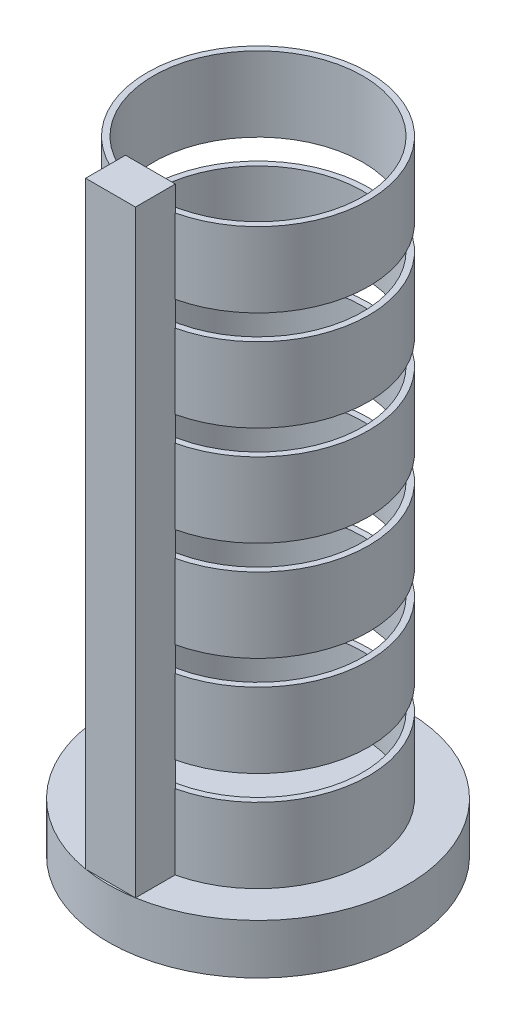
ISO-10303-21;
HEADER;
FILE_DESCRIPTION(('STEP AP214'),'2;1');
FILE_NAME('part.step','',(''),(''),'','','');
FILE_SCHEMA(('AUTOMOTIVE_DESIGN { 1 0 10303 214 1 1 1 1 }'));
ENDSEC;
DATA;
#1=APPLICATION_CONTEXT('core data for automotive mechanical design processes');
#2=APPLICATION_PROTOCOL_DEFINITION('international standard','automotive_design',2000,#1);
#3=PRODUCT_CONTEXT('',#1,'mechanical');
#4=PRODUCT('Part','Part','',(#3));
#5=PRODUCT_RELATED_PRODUCT_CATEGORY('part','',(#4));
#6=PRODUCT_DEFINITION_FORMATION('','',#4);
#7=PRODUCT_DEFINITION_CONTEXT('part definition',#1,'design');
#8=PRODUCT_DEFINITION('design','',#6,#7);
#9=PRODUCT_DEFINITION_SHAPE('','',#8);
#10=(LENGTH_UNIT() NAMED_UNIT(*) SI_UNIT(.MILLI.,.METRE.));
#11=(NAMED_UNIT(*) PLANE_ANGLE_UNIT() SI_UNIT($,.RADIAN.));
#12=(NAMED_UNIT(*) SI_UNIT($,.STERADIAN.) SOLID_ANGLE_UNIT());
#13=UNCERTAINTY_MEASURE_WITH_UNIT(LENGTH_MEASURE(1.E-05),#10,'distance_accuracy_value','');
#14=(GEOMETRIC_REPRESENTATION_CONTEXT(3) GLOBAL_UNCERTAINTY_ASSIGNED_CONTEXT((#13)) GLOBAL_UNIT_ASSIGNED_CONTEXT((#10,
#11,#12)) REPRESENTATION_CONTEXT('',''));
#15=CARTESIAN_POINT('',(0.,0.,0.));
#16=DIRECTION('',(0.,0.,1.));
#17=DIRECTION('',(1.,0.,0.));
#18=AXIS2_PLACEMENT_3D('',#15,#16,#17);
#19=CARTESIAN_POINT('',(-6.35,165.1,27.4071066226826));
#20=DIRECTION('',(1.,0.,0.));
#21=DIRECTION('',(0.,0.,-1.));
#22=AXIS2_PLACEMENT_3D('',#19,#20,#21);
#23=PLANE('',#22);
#24=DIRECTION('',(0.,0.,1.));
#25=VECTOR('',#24,1.);
#26=CARTESIAN_POINT('',(-6.35,139.7,27.4071066226826));
#27=LINE('',#26,#25);
#28=CARTESIAN_POINT('',(-6.35,139.7,27.4071066226826));
#29=VERTEX_POINT('',#28);
#30=CARTESIAN_POINT('',(-6.35,139.7,27.4696038558986));
#31=VERTEX_POINT('',#30);
#32=EDGE_CURVE('E246',#29,#31,#27,.T.);
#33=ORIENTED_EDGE('',*,*,#32,.F.);
#34=DIRECTION('',(0.,-1.,0.));
#35=VECTOR('',#34,1.);
#36=CARTESIAN_POINT('',(-6.35,165.1,27.4071066226826));
#37=LINE('',#36,#35);
#38=CARTESIAN_POINT('',(-6.35,133.35,27.4071066226826));
#39=VERTEX_POINT('',#38);
#40=EDGE_CURVE('E67',#29,#39,#37,.T.);
#41=ORIENTED_EDGE('',*,*,#40,.T.);
#42=DIRECTION('',(0.,0.,1.));
#43=VECTOR('',#42,1.);
#44=CARTESIAN_POINT('',(-6.35,133.35,27.4071066226826));
#45=LINE('',#44,#43);
#46=CARTESIAN_POINT('',(-6.35,133.35,27.4696038558986));
#47=VERTEX_POINT('',#46);
#48=EDGE_CURVE('E274',#39,#47,#45,.T.);
#49=ORIENTED_EDGE('',*,*,#48,.T.);
#50=DIRECTION('',(0.,1.,0.));
#51=VECTOR('',#50,1.);
#52=CARTESIAN_POINT('',(-6.35,114.3,27.4696038558986));
#53=LINE('',#52,#51);
#54=CARTESIAN_POINT('',(-6.35,114.3,27.4696038558986));
#55=VERTEX_POINT('',#54);
#56=EDGE_CURVE('E283',#47,#55,#53,.F.);
#57=ORIENTED_EDGE('',*,*,#56,.T.);
#58=DIRECTION('',(0.,0.,1.));
#59=VECTOR('',#58,1.);
#60=CARTESIAN_POINT('',(-6.35,114.3,27.4071066226826));
#61=LINE('',#60,#59);
#62=CARTESIAN_POINT('',(-6.35,114.3,27.4071066226826));
#63=VERTEX_POINT('',#62);
#64=EDGE_CURVE('E280',#63,#55,#61,.T.);
#65=ORIENTED_EDGE('',*,*,#64,.F.);
#66=CARTESIAN_POINT('',(-6.35,107.95,27.4071066226826));
#67=VERTEX_POINT('',#66);
#68=EDGE_CURVE('E525',#63,#67,#37,.T.);
#69=ORIENTED_EDGE('',*,*,#68,.T.);
#70=DIRECTION('',(0.,0.,1.));
#71=VECTOR('',#70,1.);
#72=CARTESIAN_POINT('',(-6.35,107.95,27.4071066226826));
#73=LINE('',#72,#71);
#74=CARTESIAN_POINT('',(-6.35,107.95,27.4696038558986));
#75=VERTEX_POINT('',#74);
#76=EDGE_CURVE('E307',#67,#75,#73,.T.);
#77=ORIENTED_EDGE('',*,*,#76,.T.);
#78=DIRECTION('',(0.,1.,0.));
#79=VECTOR('',#78,1.);
#80=CARTESIAN_POINT('',(-6.35,88.9,27.4696038558986));
#81=LINE('',#80,#79);
#82=CARTESIAN_POINT('',(-6.35,88.9,27.4696038558986));
#83=VERTEX_POINT('',#82);
#84=EDGE_CURVE('E317',#75,#83,#81,.F.);
#85=ORIENTED_EDGE('',*,*,#84,.T.);
#86=DIRECTION('',(0.,0.,1.));
#87=VECTOR('',#86,1.);
#88=CARTESIAN_POINT('',(-6.35,88.9,27.4071066226826));
#89=LINE('',#88,#87);
#90=CARTESIAN_POINT('',(-6.35,88.9,27.4071066226826));
#91=VERTEX_POINT('',#90);
#92=EDGE_CURVE('E314',#91,#83,#89,.T.);
#93=ORIENTED_EDGE('',*,*,#92,.F.);
#94=CARTESIAN_POINT('',(-6.35,82.55,27.4071066226826));
#95=VERTEX_POINT('',#94);
#96=EDGE_CURVE('E527',#91,#95,#37,.T.);
#97=ORIENTED_EDGE('',*,*,#96,.T.);
#98=DIRECTION('',(0.,0.,1.));
#99=VECTOR('',#98,1.);
#100=CARTESIAN_POINT('',(-6.35,82.55,27.4071066226826));
#101=LINE('',#100,#99);
#102=CARTESIAN_POINT('',(-6.35,82.55,27.4696038558986));
#103=VERTEX_POINT('',#102);
#104=EDGE_CURVE('E341',#95,#103,#101,.T.);
#105=ORIENTED_EDGE('',*,*,#104,.T.);
#106=DIRECTION('',(0.,1.,0.));
#107=VECTOR('',#106,1.);
#108=CARTESIAN_POINT('',(-6.35,63.5,27.4696038558986));
#109=LINE('',#108,#107);
#110=CARTESIAN_POINT('',(-6.35,63.5,27.4696038558986));
#111=VERTEX_POINT('',#110);
#112=EDGE_CURVE('E351',#103,#111,#109,.F.);
#113=ORIENTED_EDGE('',*,*,#112,.T.);
#114=DIRECTION('',(0.,0.,1.));
#115=VECTOR('',#114,1.);
#116=CARTESIAN_POINT('',(-6.35,63.5,27.4071066226826));
#117=LINE('',#116,#115);
#118=CARTESIAN_POINT('',(-6.35,63.5,27.4071066226826));
#119=VERTEX_POINT('',#118);
#120=EDGE_CURVE('E348',#119,#111,#117,.T.);
#121=ORIENTED_EDGE('',*,*,#120,.F.);
#122=CARTESIAN_POINT('',(-6.35,57.15,27.4071066226826));
#123=VERTEX_POINT('',#122);
#124=EDGE_CURVE('E532',#119,#123,#37,.T.);
#125=ORIENTED_EDGE('',*,*,#124,.T.);
#126=DIRECTION('',(0.,0.,1.));
#127=VECTOR('',#126,1.);
#128=CARTESIAN_POINT('',(-6.35,57.15,27.4071066226826));
#129=LINE('',#128,#127);
#130=CARTESIAN_POINT('',(-6.35,57.15,27.4696038558986));
#131=VERTEX_POINT('',#130);
#132=EDGE_CURVE('E375',#123,#131,#129,.T.);
#133=ORIENTED_EDGE('',*,*,#132,.T.);
#134=DIRECTION('',(0.,1.,0.));
#135=VECTOR('',#134,1.);
#136=CARTESIAN_POINT('',(-6.35,38.1,27.4696038558986));
#137=LINE('',#136,#135);
#138=CARTESIAN_POINT('',(-6.35,38.1,27.4696038558986));
#139=VERTEX_POINT('',#138);
#140=EDGE_CURVE('E385',#131,#139,#137,.F.);
#141=ORIENTED_EDGE('',*,*,#140,.T.);
#142=DIRECTION('',(0.,0.,1.));
#143=VECTOR('',#142,1.);
#144=CARTESIAN_POINT('',(-6.35,38.1,27.4071066226826));
#145=LINE('',#144,#143);
#146=CARTESIAN_POINT('',(-6.35,38.1,27.4071066226826));
#147=VERTEX_POINT('',#146);
#148=EDGE_CURVE('E382',#147,#139,#145,.T.);
#149=ORIENTED_EDGE('',*,*,#148,.F.);
#150=CARTESIAN_POINT('',(-6.35,31.7500000000001,27.4071066226826));
#151=VERTEX_POINT('',#150);
#152=EDGE_CURVE('E431',#147,#151,#37,.T.);
#153=ORIENTED_EDGE('',*,*,#152,.T.);
#154=DIRECTION('',(0.,0.,1.));
#155=VECTOR('',#154,1.);
#156=CARTESIAN_POINT('',(-6.35,31.75,27.4071066226826));
#157=LINE('',#156,#155);
#158=CARTESIAN_POINT('',(-6.35,31.75,27.4696038558986));
#159=VERTEX_POINT('',#158);
#160=EDGE_CURVE('E408',#151,#159,#157,.T.);
#161=ORIENTED_EDGE('',*,*,#160,.T.);
#162=DIRECTION('',(0.,1.,0.));
#163=VECTOR('',#162,1.);
#164=CARTESIAN_POINT('',(-6.35,12.7,27.4696038558986));
#165=LINE('',#164,#163);
#166=CARTESIAN_POINT('',(-6.35,12.7,27.4696038558986));
#167=VERTEX_POINT('',#166);
#168=EDGE_CURVE('E412',#159,#167,#165,.F.);
#169=ORIENTED_EDGE('',*,*,#168,.T.);
#170=DIRECTION('',(0.,0.,1.));
#171=VECTOR('',#170,1.);
#172=CARTESIAN_POINT('',(-6.35,12.7,27.4071066226826));
#173=LINE('',#172,#171);
#174=CARTESIAN_POINT('',(-6.35000000000001,12.7,37.5671066226826));
#175=VERTEX_POINT('',#174);
#176=EDGE_CURVE('E416',#167,#175,#173,.T.);
#177=ORIENTED_EDGE('',*,*,#176,.T.);
#178=DIRECTION('',(0.,-1.,0.));
#179=VECTOR('',#178,1.);
#180=CARTESIAN_POINT('',(-6.35,165.1,37.5671066226826));
#181=LINE('',#180,#179);
#182=CARTESIAN_POINT('',(-6.35,165.1,37.5671066226826));
#183=VERTEX_POINT('',#182);
#184=EDGE_CURVE('E453',#183,#175,#181,.T.);
#185=ORIENTED_EDGE('',*,*,#184,.F.);
#186=DIRECTION('',(0.,0.,1.));
#187=VECTOR('',#186,1.);
#188=CARTESIAN_POINT('',(-6.35,165.1,27.4071066226826));
#189=LINE('',#188,#187);
#190=CARTESIAN_POINT('',(-6.35,165.1,27.4071066226826));
#191=VERTEX_POINT('',#190);
#192=EDGE_CURVE('E417',#191,#183,#189,.T.);
#193=ORIENTED_EDGE('',*,*,#192,.F.);
#194=CARTESIAN_POINT('',(-6.35,158.75,27.4071066226826));
#195=VERTEX_POINT('',#194);
#196=EDGE_CURVE('E441',#191,#195,#37,.T.);
#197=ORIENTED_EDGE('',*,*,#196,.T.);
#198=DIRECTION('',(0.,0.,1.));
#199=VECTOR('',#198,1.);
#200=CARTESIAN_POINT('',(-6.35,158.75,27.4071066226826));
#201=LINE('',#200,#199);
#202=CARTESIAN_POINT('',(-6.35,158.75,27.4696038558986));
#203=VERTEX_POINT('',#202);
#204=EDGE_CURVE('E59',#195,#203,#201,.T.);
#205=ORIENTED_EDGE('',*,*,#204,.T.);
#206=DIRECTION('',(0.,1.,0.));
#207=VECTOR('',#206,1.);
#208=CARTESIAN_POINT('',(-6.35,139.7,27.4696038558986));
#209=LINE('',#208,#207);
#210=EDGE_CURVE('E233',#203,#31,#209,.F.);
#211=ORIENTED_EDGE('',*,*,#210,.T.);
#212=EDGE_LOOP('',(#33,#41,#49,#57,#65,#69,#77,#85,#93,#97,#105,#113,#121,#125,#133,#141,#149,
#153,#161,#169,#177,#185,#193,#197,#205,#211));
#213=FACE_BOUND('',#212,.T.);
#214=ADVANCED_FACE('F43',(#213),#23,.F.);
#215=CARTESIAN_POINT('',(6.35,165.1,27.4071066226826));
#216=DIRECTION('',(-1.,0.,0.));
#217=DIRECTION('',(0.,0.,1.));
#218=AXIS2_PLACEMENT_3D('',#215,#216,#217);
#219=PLANE('',#218);
#220=DIRECTION('',(0.,0.,-1.));
#221=VECTOR('',#220,1.);
#222=CARTESIAN_POINT('',(6.35,139.7,27.4071066226826));
#223=LINE('',#222,#221);
#224=CARTESIAN_POINT('',(6.35,139.7,27.4696038558986));
#225=VERTEX_POINT('',#224);
#226=CARTESIAN_POINT('',(6.35,139.7,27.4071066226826));
#227=VERTEX_POINT('',#226);
#228=EDGE_CURVE('E240',#225,#227,#223,.T.);
#229=ORIENTED_EDGE('',*,*,#228,.F.);
#230=DIRECTION('',(0.,1.,0.));
#231=VECTOR('',#230,1.);
#232=CARTESIAN_POINT('',(6.35,139.7,27.4696038558986));
#233=LINE('',#232,#231);
#234=CARTESIAN_POINT('',(6.35,158.75,27.4696038558986));
#235=VERTEX_POINT('',#234);
#236=EDGE_CURVE('E11',#225,#235,#233,.T.);
#237=ORIENTED_EDGE('',*,*,#236,.T.);
#238=DIRECTION('',(0.,0.,-1.));
#239=VECTOR('',#238,1.);
#240=CARTESIAN_POINT('',(6.35,158.75,27.4071066226826));
#241=LINE('',#240,#239);
#242=CARTESIAN_POINT('',(6.35,158.75,27.4071066226826));
#243=VERTEX_POINT('',#242);
#244=EDGE_CURVE('E218',#235,#243,#241,.T.);
#245=ORIENTED_EDGE('',*,*,#244,.T.);
#246=DIRECTION('',(0.,-1.,0.));
#247=VECTOR('',#246,1.);
#248=CARTESIAN_POINT('',(6.35,165.1,27.4071066226826));
#249=LINE('',#248,#247);
#250=CARTESIAN_POINT('',(6.35,165.1,27.4071066226826));
#251=VERTEX_POINT('',#250);
#252=EDGE_CURVE('E446',#251,#243,#249,.T.);
#253=ORIENTED_EDGE('',*,*,#252,.F.);
#254=DIRECTION('',(0.,0.,-1.));
#255=VECTOR('',#254,1.);
#256=CARTESIAN_POINT('',(6.35,165.1,27.4071066226826));
#257=LINE('',#256,#255);
#258=CARTESIAN_POINT('',(6.35,165.1,37.5671066226826));
#259=VERTEX_POINT('',#258);
#260=EDGE_CURVE('E425',#259,#251,#257,.T.);
#261=ORIENTED_EDGE('',*,*,#260,.F.);
#262=DIRECTION('',(0.,-1.,0.));
#263=VECTOR('',#262,1.);
#264=CARTESIAN_POINT('',(6.35,165.1,37.5671066226826));
#265=LINE('',#264,#263);
#266=CARTESIAN_POINT('',(6.35,12.7,37.5671066226826));
#267=VERTEX_POINT('',#266);
#268=EDGE_CURVE('E449',#259,#267,#265,.T.);
#269=ORIENTED_EDGE('',*,*,#268,.T.);
#270=DIRECTION('',(0.,0.,-1.));
#271=VECTOR('',#270,1.);
#272=CARTESIAN_POINT('',(6.35,12.7,27.4071066226826));
#273=LINE('',#272,#271);
#274=CARTESIAN_POINT('',(6.35,12.7,27.4696038558986));
#275=VERTEX_POINT('',#274);
#276=EDGE_CURVE('E422',#267,#275,#273,.T.);
#277=ORIENTED_EDGE('',*,*,#276,.T.);
#278=DIRECTION('',(0.,1.,0.));
#279=VECTOR('',#278,1.);
#280=CARTESIAN_POINT('',(6.35,12.7,27.4696038558986));
#281=LINE('',#280,#279);
#282=CARTESIAN_POINT('',(6.35,31.75,27.4696038558986));
#283=VERTEX_POINT('',#282);
#284=EDGE_CURVE('E470',#275,#283,#281,.T.);
#285=ORIENTED_EDGE('',*,*,#284,.T.);
#286=DIRECTION('',(0.,0.,-1.));
#287=VECTOR('',#286,1.);
#288=CARTESIAN_POINT('',(6.35,31.75,27.4071066226826));
#289=LINE('',#288,#287);
#290=CARTESIAN_POINT('',(6.35,31.75,27.4071066226826));
#291=VERTEX_POINT('',#290);
#292=EDGE_CURVE('E402',#283,#291,#289,.T.);
#293=ORIENTED_EDGE('',*,*,#292,.T.);
#294=CARTESIAN_POINT('',(6.35,38.1,27.4071066226826));
#295=VERTEX_POINT('',#294);
#296=EDGE_CURVE('E445',#295,#291,#249,.T.);
#297=ORIENTED_EDGE('',*,*,#296,.F.);
#298=DIRECTION('',(0.,0.,-1.));
#299=VECTOR('',#298,1.);
#300=CARTESIAN_POINT('',(6.35,38.1,27.4071066226826));
#301=LINE('',#300,#299);
#302=CARTESIAN_POINT('',(6.35,38.1,27.4696038558986));
#303=VERTEX_POINT('',#302);
#304=EDGE_CURVE('E379',#303,#295,#301,.T.);
#305=ORIENTED_EDGE('',*,*,#304,.F.);
#306=DIRECTION('',(0.,1.,0.));
#307=VECTOR('',#306,1.);
#308=CARTESIAN_POINT('',(6.35,38.1,27.4696038558986));
#309=LINE('',#308,#307);
#310=CARTESIAN_POINT('',(6.35,57.15,27.4696038558986));
#311=VERTEX_POINT('',#310);
#312=EDGE_CURVE('E481',#303,#311,#309,.T.);
#313=ORIENTED_EDGE('',*,*,#312,.T.);
#314=DIRECTION('',(0.,0.,-1.));
#315=VECTOR('',#314,1.);
#316=CARTESIAN_POINT('',(6.35,57.15,27.4071066226826));
#317=LINE('',#316,#315);
#318=CARTESIAN_POINT('',(6.35,57.15,27.4071066226826));
#319=VERTEX_POINT('',#318);
#320=EDGE_CURVE('E368',#311,#319,#317,.T.);
#321=ORIENTED_EDGE('',*,*,#320,.T.);
#322=CARTESIAN_POINT('',(6.35,63.5,27.4071066226826));
#323=VERTEX_POINT('',#322);
#324=EDGE_CURVE('E554',#323,#319,#249,.T.);
#325=ORIENTED_EDGE('',*,*,#324,.F.);
#326=DIRECTION('',(0.,0.,-1.));
#327=VECTOR('',#326,1.);
#328=CARTESIAN_POINT('',(6.35,63.5,27.4071066226826));
#329=LINE('',#328,#327);
#330=CARTESIAN_POINT('',(6.35,63.5,27.4696038558986));
#331=VERTEX_POINT('',#330);
#332=EDGE_CURVE('E345',#331,#323,#329,.T.);
#333=ORIENTED_EDGE('',*,*,#332,.F.);
#334=DIRECTION('',(0.,1.,0.));
#335=VECTOR('',#334,1.);
#336=CARTESIAN_POINT('',(6.35,63.5,27.4696038558986));
#337=LINE('',#336,#335);
#338=CARTESIAN_POINT('',(6.35,82.55,27.4696038558986));
#339=VERTEX_POINT('',#338);
#340=EDGE_CURVE('E492',#331,#339,#337,.T.);
#341=ORIENTED_EDGE('',*,*,#340,.T.);
#342=DIRECTION('',(0.,0.,-1.));
#343=VECTOR('',#342,1.);
#344=CARTESIAN_POINT('',(6.35,82.55,27.4071066226826));
#345=LINE('',#344,#343);
#346=CARTESIAN_POINT('',(6.35,82.55,27.4071066226826));
#347=VERTEX_POINT('',#346);
#348=EDGE_CURVE('E334',#339,#347,#345,.T.);
#349=ORIENTED_EDGE('',*,*,#348,.T.);
#350=CARTESIAN_POINT('',(6.35,88.9,27.4071066226826));
#351=VERTEX_POINT('',#350);
#352=EDGE_CURVE('E556',#351,#347,#249,.T.);
#353=ORIENTED_EDGE('',*,*,#352,.F.);
#354=DIRECTION('',(0.,0.,-1.));
#355=VECTOR('',#354,1.);
#356=CARTESIAN_POINT('',(6.35,88.9,27.4071066226826));
#357=LINE('',#356,#355);
#358=CARTESIAN_POINT('',(6.35,88.9,27.4696038558986));
#359=VERTEX_POINT('',#358);
#360=EDGE_CURVE('E311',#359,#351,#357,.T.);
#361=ORIENTED_EDGE('',*,*,#360,.F.);
#362=DIRECTION('',(0.,1.,0.));
#363=VECTOR('',#362,1.);
#364=CARTESIAN_POINT('',(6.35,88.9,27.4696038558986));
#365=LINE('',#364,#363);
#366=CARTESIAN_POINT('',(6.35,107.95,27.4696038558986));
#367=VERTEX_POINT('',#366);
#368=EDGE_CURVE('E503',#359,#367,#365,.T.);
#369=ORIENTED_EDGE('',*,*,#368,.T.);
#370=DIRECTION('',(0.,0.,-1.));
#371=VECTOR('',#370,1.);
#372=CARTESIAN_POINT('',(6.35,107.95,27.4071066226826));
#373=LINE('',#372,#371);
#374=CARTESIAN_POINT('',(6.35,107.95,27.4071066226826));
#375=VERTEX_POINT('',#374);
#376=EDGE_CURVE('E300',#367,#375,#373,.T.);
#377=ORIENTED_EDGE('',*,*,#376,.T.);
#378=CARTESIAN_POINT('',(6.35,114.3,27.4071066226826));
#379=VERTEX_POINT('',#378);
#380=EDGE_CURVE('E562',#379,#375,#249,.T.);
#381=ORIENTED_EDGE('',*,*,#380,.F.);
#382=DIRECTION('',(0.,0.,-1.));
#383=VECTOR('',#382,1.);
#384=CARTESIAN_POINT('',(6.35,114.3,27.4071066226826));
#385=LINE('',#384,#383);
#386=CARTESIAN_POINT('',(6.35,114.3,27.4696038558986));
#387=VERTEX_POINT('',#386);
#388=EDGE_CURVE('E277',#387,#379,#385,.T.);
#389=ORIENTED_EDGE('',*,*,#388,.F.);
#390=DIRECTION('',(0.,1.,0.));
#391=VECTOR('',#390,1.);
#392=CARTESIAN_POINT('',(6.35,114.3,27.4696038558986));
#393=LINE('',#392,#391);
#394=CARTESIAN_POINT('',(6.35,133.35,27.4696038558986));
#395=VERTEX_POINT('',#394);
#396=EDGE_CURVE('E514',#387,#395,#393,.T.);
#397=ORIENTED_EDGE('',*,*,#396,.T.);
#398=DIRECTION('',(0.,0.,-1.));
#399=VECTOR('',#398,1.);
#400=CARTESIAN_POINT('',(6.35,133.35,27.4071066226826));
#401=LINE('',#400,#399);
#402=CARTESIAN_POINT('',(6.35,133.35,27.4071066226826));
#403=VERTEX_POINT('',#402);
#404=EDGE_CURVE('E268',#395,#403,#401,.T.);
#405=ORIENTED_EDGE('',*,*,#404,.T.);
#406=EDGE_CURVE('E242',#227,#403,#249,.T.);
#407=ORIENTED_EDGE('',*,*,#406,.F.);
#408=EDGE_LOOP('',(#229,#237,#245,#253,#261,#269,#277,#285,#293,#297,#305,#313,#321,#325,#333,
#341,#349,#353,#361,#369,#377,#381,#389,#397,#405,#407));
#409=FACE_BOUND('',#408,.T.);
#410=ADVANCED_FACE('F238',(#409),#219,.F.);
#411=CARTESIAN_POINT('',(-6.35,165.1,27.4071066226826));
#412=DIRECTION('',(0.,0.,1.));
#413=DIRECTION('',(1.,0.,0.));
#414=AXIS2_PLACEMENT_3D('',#411,#412,#413);
#415=PLANE('',#414);
#416=DIRECTION('',(-1.,0.,0.));
#417=VECTOR('',#416,1.);
#418=CARTESIAN_POINT('',(-6.35,139.7,27.4071066226826));
#419=LINE('',#418,#417);
#420=EDGE_CURVE('E52',#227,#29,#419,.T.);
#421=ORIENTED_EDGE('',*,*,#420,.F.);
#422=ORIENTED_EDGE('',*,*,#406,.T.);
#423=DIRECTION('',(-1.,0.,0.));
#424=VECTOR('',#423,1.);
#425=CARTESIAN_POINT('',(-6.35,133.35,27.4071066226826));
#426=LINE('',#425,#424);
#427=EDGE_CURVE('E507',#403,#39,#426,.T.);
#428=ORIENTED_EDGE('',*,*,#427,.T.);
#429=ORIENTED_EDGE('',*,*,#40,.F.);
#430=EDGE_LOOP('',(#421,#422,#428,#429));
#431=FACE_BOUND('',#430,.T.);
#432=ADVANCED_FACE('F522',(#431),#415,.F.);
#433=DIRECTION('',(-1.,0.,0.));
#434=VECTOR('',#433,1.);
#435=CARTESIAN_POINT('',(-6.35,114.3,27.4071066226826));
#436=LINE('',#435,#434);
#437=EDGE_CURVE('E511',#379,#63,#436,.T.);
#438=ORIENTED_EDGE('',*,*,#437,.F.);
#439=ORIENTED_EDGE('',*,*,#380,.T.);
#440=DIRECTION('',(-1.,0.,0.));
#441=VECTOR('',#440,1.);
#442=CARTESIAN_POINT('',(-6.35,107.95,27.4071066226826));
#443=LINE('',#442,#441);
#444=EDGE_CURVE('E496',#375,#67,#443,.T.);
#445=ORIENTED_EDGE('',*,*,#444,.T.);
#446=ORIENTED_EDGE('',*,*,#68,.F.);
#447=EDGE_LOOP('',(#438,#439,#445,#446));
#448=FACE_BOUND('',#447,.T.);
#449=ADVANCED_FACE('F582',(#448),#415,.F.);
#450=DIRECTION('',(-1.,0.,0.));
#451=VECTOR('',#450,1.);
#452=CARTESIAN_POINT('',(-6.35,88.9,27.4071066226826));
#453=LINE('',#452,#451);
#454=EDGE_CURVE('E500',#351,#91,#453,.T.);
#455=ORIENTED_EDGE('',*,*,#454,.F.);
#456=ORIENTED_EDGE('',*,*,#352,.T.);
#457=DIRECTION('',(-1.,0.,0.));
#458=VECTOR('',#457,1.);
#459=CARTESIAN_POINT('',(-6.35,82.55,27.4071066226826));
#460=LINE('',#459,#458);
#461=EDGE_CURVE('E485',#347,#95,#460,.T.);
#462=ORIENTED_EDGE('',*,*,#461,.T.);
#463=ORIENTED_EDGE('',*,*,#96,.F.);
#464=EDGE_LOOP('',(#455,#456,#462,#463));
#465=FACE_BOUND('',#464,.T.);
#466=ADVANCED_FACE('F592',(#465),#415,.F.);
#467=DIRECTION('',(-1.,0.,0.));
#468=VECTOR('',#467,1.);
#469=CARTESIAN_POINT('',(-6.35,63.5,27.4071066226826));
#470=LINE('',#469,#468);
#471=EDGE_CURVE('E489',#323,#119,#470,.T.);
#472=ORIENTED_EDGE('',*,*,#471,.F.);
#473=ORIENTED_EDGE('',*,*,#324,.T.);
#474=DIRECTION('',(-1.,0.,0.));
#475=VECTOR('',#474,1.);
#476=CARTESIAN_POINT('',(-6.35,57.15,27.4071066226826));
#477=LINE('',#476,#475);
#478=EDGE_CURVE('E474',#319,#123,#477,.T.);
#479=ORIENTED_EDGE('',*,*,#478,.T.);
#480=ORIENTED_EDGE('',*,*,#124,.F.);
#481=EDGE_LOOP('',(#472,#473,#479,#480));
#482=FACE_BOUND('',#481,.T.);
#483=ADVANCED_FACE('F602',(#482),#415,.F.);
#484=DIRECTION('',(-1.,0.,0.));
#485=VECTOR('',#484,1.);
#486=CARTESIAN_POINT('',(-6.35,38.1,27.4071066226826));
#487=LINE('',#486,#485);
#488=EDGE_CURVE('E478',#295,#147,#487,.T.);
#489=ORIENTED_EDGE('',*,*,#488,.F.);
#490=ORIENTED_EDGE('',*,*,#296,.T.);
#491=DIRECTION('',(-1.,0.,0.));
#492=VECTOR('',#491,1.);
#493=CARTESIAN_POINT('',(-6.35,31.75,27.4071066226826));
#494=LINE('',#493,#492);
#495=EDGE_CURVE('E462',#291,#151,#494,.T.);
#496=ORIENTED_EDGE('',*,*,#495,.T.);
#497=ORIENTED_EDGE('',*,*,#152,.F.);
#498=EDGE_LOOP('',(#489,#490,#496,#497));
#499=FACE_BOUND('',#498,.T.);
#500=ADVANCED_FACE('F550',(#499),#415,.F.);
#501=CARTESIAN_POINT('',(0.,12.7,0.));
#502=DIRECTION('',(0.,1.,0.));
#503=DIRECTION('',(0.,0.,1.));
#504=AXIS2_PLACEMENT_3D('',#501,#502,#503);
#505=PLANE('',#504);
#506=CARTESIAN_POINT('',(0.,12.7,0.));
#507=DIRECTION('',(0.,1.,0.));
#508=DIRECTION('',(0.,0.,1.));
#509=AXIS2_PLACEMENT_3D('',#506,#507,#508);
#510=CIRCLE('',#509,28.194);
#511=EDGE_CURVE('E397',#275,#167,#510,.T.);
#512=ORIENTED_EDGE('',*,*,#511,.F.);
#513=ORIENTED_EDGE('',*,*,#276,.F.);
#514=CARTESIAN_POINT('',(0.,12.7,0.));
#515=DIRECTION('',(0.,1.,0.));
#516=DIRECTION('',(0.,0.,1.));
#517=AXIS2_PLACEMENT_3D('',#514,#515,#516);
#518=CIRCLE('',#517,38.1);
#519=EDGE_CURVE('E458',#267,#175,#518,.T.);
#520=ORIENTED_EDGE('',*,*,#519,.T.);
#521=ORIENTED_EDGE('',*,*,#176,.F.);
#522=EDGE_LOOP('',(#512,#513,#520,#521));
#523=FACE_BOUND('',#522,.T.);
#524=ADVANCED_FACE('F636',(#523),#505,.T.);
#525=CARTESIAN_POINT('',(0.,12.7,0.));
#526=DIRECTION('',(0.,-1.,0.));
#527=DIRECTION('',(0.,0.,-1.));
#528=AXIS2_PLACEMENT_3D('',#525,#526,#527);
#529=CYLINDRICAL_SURFACE('',#528,38.1);
#530=ORIENTED_EDGE('',*,*,#519,.F.);
#531=EDGE_CURVE('E463',#175,#267,#518,.T.);
#532=ORIENTED_EDGE('',*,*,#531,.F.);
#533=EDGE_LOOP('',(#530,#532));
#534=FACE_BOUND('',#533,.T.);
#535=CARTESIAN_POINT('',(0.,0.,0.));
#536=DIRECTION('',(0.,1.,0.));
#537=DIRECTION('',(0.,0.,1.));
#538=AXIS2_PLACEMENT_3D('',#535,#536,#537);
#539=CIRCLE('',#538,38.1);
#540=CARTESIAN_POINT('',(0.,0.,38.1));
#541=VERTEX_POINT('',#540);
#542=EDGE_CURVE('E457',#541,#541,#539,.T.);
#543=ORIENTED_EDGE('',*,*,#542,.T.);
#544=EDGE_LOOP('',(#543));
#545=FACE_BOUND('',#544,.T.);
#546=ADVANCED_FACE('F45',(#534,#545),#529,.T.);
#547=DIRECTION('',(1.,0.,0.));
#548=VECTOR('',#547,1.);
#549=CARTESIAN_POINT('',(-6.35,12.7,37.5671066226826));
#550=LINE('',#549,#548);
#551=EDGE_CURVE('E434',#175,#267,#550,.T.);
#552=ORIENTED_EDGE('',*,*,#551,.F.);
#553=ORIENTED_EDGE('',*,*,#531,.T.);
#554=EDGE_LOOP('',(#552,#553));
#555=FACE_BOUND('',#554,.T.);
#556=ADVANCED_FACE('F632',(#555),#505,.T.);
#557=CARTESIAN_POINT('',(0.,0.,0.));
#558=DIRECTION('',(0.,1.,0.));
#559=DIRECTION('',(0.,0.,1.));
#560=AXIS2_PLACEMENT_3D('',#557,#558,#559);
#561=PLANE('',#560);
#562=ORIENTED_EDGE('',*,*,#542,.F.);
#563=EDGE_LOOP('',(#562));
#564=FACE_BOUND('',#563,.T.);
#565=ADVANCED_FACE('F634',(#564),#561,.F.);
#566=CARTESIAN_POINT('',(-6.35,165.1,37.5671066226826));
#567=DIRECTION('',(0.,0.,-1.));
#568=DIRECTION('',(-1.,0.,0.));
#569=AXIS2_PLACEMENT_3D('',#566,#567,#568);
#570=PLANE('',#569);
#571=ORIENTED_EDGE('',*,*,#551,.T.);
#572=ORIENTED_EDGE('',*,*,#268,.F.);
#573=DIRECTION('',(1.,0.,0.));
#574=VECTOR('',#573,1.);
#575=CARTESIAN_POINT('',(-6.35,165.1,37.5671066226826));
#576=LINE('',#575,#574);
#577=EDGE_CURVE('E421',#183,#259,#576,.T.);
#578=ORIENTED_EDGE('',*,*,#577,.F.);
#579=ORIENTED_EDGE('',*,*,#184,.T.);
#580=EDGE_LOOP('',(#571,#572,#578,#579));
#581=FACE_BOUND('',#580,.T.);
#582=ADVANCED_FACE('F631',(#581),#570,.F.);
#583=ORIENTED_EDGE('',*,*,#252,.T.);
#584=DIRECTION('',(-1.,0.,0.));
#585=VECTOR('',#584,1.);
#586=CARTESIAN_POINT('',(-6.35,158.75,27.4071066226826));
#587=LINE('',#586,#585);
#588=EDGE_CURVE('E222',#243,#195,#587,.T.);
#589=ORIENTED_EDGE('',*,*,#588,.T.);
#590=ORIENTED_EDGE('',*,*,#196,.F.);
#591=DIRECTION('',(-1.,0.,0.));
#592=VECTOR('',#591,1.);
#593=CARTESIAN_POINT('',(-6.35,165.1,27.4071066226826));
#594=LINE('',#593,#592);
#595=EDGE_CURVE('E428',#251,#191,#594,.T.);
#596=ORIENTED_EDGE('',*,*,#595,.F.);
#597=EDGE_LOOP('',(#583,#589,#590,#596));
#598=FACE_BOUND('',#597,.T.);
#599=ADVANCED_FACE('F642',(#598),#415,.F.);
#600=CARTESIAN_POINT('',(0.,165.1,0.));
#601=DIRECTION('',(0.,1.,0.));
#602=DIRECTION('',(0.,0.,1.));
#603=AXIS2_PLACEMENT_3D('',#600,#601,#602);
#604=PLANE('',#603);
#605=ORIENTED_EDGE('',*,*,#192,.T.);
#606=ORIENTED_EDGE('',*,*,#577,.T.);
#607=ORIENTED_EDGE('',*,*,#260,.T.);
#608=ORIENTED_EDGE('',*,*,#595,.T.);
#609=EDGE_LOOP('',(#605,#606,#607,#608));
#610=FACE_BOUND('',#609,.T.);
#611=ADVANCED_FACE('F664',(#610),#604,.T.);
#612=CARTESIAN_POINT('',(0.,12.7,0.));
#613=DIRECTION('',(0.,1.,0.));
#614=DIRECTION('',(0.,0.,1.));
#615=AXIS2_PLACEMENT_3D('',#612,#613,#614);
#616=CYLINDRICAL_SURFACE('',#615,28.194);
#617=ORIENTED_EDGE('',*,*,#168,.F.);
#618=CARTESIAN_POINT('',(0.,31.75,0.));
#619=DIRECTION('',(0.,1.,0.));
#620=DIRECTION('',(0.,0.,1.));
#621=AXIS2_PLACEMENT_3D('',#618,#619,#620);
#622=CIRCLE('',#621,28.194);
#623=EDGE_CURVE('E398',#283,#159,#622,.T.);
#624=ORIENTED_EDGE('',*,*,#623,.F.);
#625=ORIENTED_EDGE('',*,*,#284,.F.);
#626=ORIENTED_EDGE('',*,*,#511,.T.);
#627=EDGE_LOOP('',(#617,#624,#625,#626));
#628=FACE_BOUND('',#627,.T.);
#629=ADVANCED_FACE('F668',(#628),#616,.T.);
#630=CARTESIAN_POINT('',(0.,31.75,0.));
#631=DIRECTION('',(0.,1.,0.));
#632=DIRECTION('',(0.,0.,1.));
#633=AXIS2_PLACEMENT_3D('',#630,#631,#632);
#634=PLANE('',#633);
#635=CARTESIAN_POINT('',(0.,31.75,0.));
#636=DIRECTION('',(0.,1.,0.));
#637=DIRECTION('',(0.,0.,1.));
#638=AXIS2_PLACEMENT_3D('',#635,#636,#637);
#639=CIRCLE('',#638,26.67);
#640=CARTESIAN_POINT('',(0.,31.75,26.67));
#641=VERTEX_POINT('',#640);
#642=EDGE_CURVE('E393',#641,#641,#639,.T.);
#643=ORIENTED_EDGE('',*,*,#642,.F.);
#644=EDGE_LOOP('',(#643));
#645=FACE_BOUND('',#644,.T.);
#646=ORIENTED_EDGE('',*,*,#160,.F.);
#647=ORIENTED_EDGE('',*,*,#495,.F.);
#648=ORIENTED_EDGE('',*,*,#292,.F.);
#649=ORIENTED_EDGE('',*,*,#623,.T.);
#650=EDGE_LOOP('',(#646,#647,#648,#649));
#651=FACE_BOUND('',#650,.T.);
#652=ADVANCED_FACE('F548',(#645,#651),#634,.T.);
#653=CARTESIAN_POINT('',(0.,12.7,0.));
#654=DIRECTION('',(0.,1.,0.));
#655=DIRECTION('',(0.,0.,1.));
#656=AXIS2_PLACEMENT_3D('',#653,#654,#655);
#657=CYLINDRICAL_SURFACE('',#656,26.67);
#658=ORIENTED_EDGE('',*,*,#642,.T.);
#659=EDGE_LOOP('',(#658));
#660=FACE_BOUND('',#659,.T.);
#661=CARTESIAN_POINT('',(0.,12.7,0.));
#662=DIRECTION('',(0.,1.,0.));
#663=DIRECTION('',(0.,0.,1.));
#664=AXIS2_PLACEMENT_3D('',#661,#662,#663);
#665=CIRCLE('',#664,26.67);
#666=CARTESIAN_POINT('',(0.,12.7,26.67));
#667=VERTEX_POINT('',#666);
#668=EDGE_CURVE('E389',#667,#667,#665,.T.);
#669=ORIENTED_EDGE('',*,*,#668,.F.);
#670=EDGE_LOOP('',(#669));
#671=FACE_BOUND('',#670,.T.);
#672=ADVANCED_FACE('F675',(#660,#671),#657,.F.);
#673=ORIENTED_EDGE('',*,*,#668,.T.);
#674=EDGE_LOOP('',(#673));
#675=FACE_BOUND('',#674,.T.);
#676=ADVANCED_FACE('F621',(#675),#505,.T.);
#677=CARTESIAN_POINT('',(0.,38.1,0.));
#678=DIRECTION('',(0.,1.,0.));
#679=DIRECTION('',(0.,0.,1.));
#680=AXIS2_PLACEMENT_3D('',#677,#678,#679);
#681=CYLINDRICAL_SURFACE('',#680,28.194);
#682=ORIENTED_EDGE('',*,*,#140,.F.);
#683=CARTESIAN_POINT('',(0.,57.15,0.));
#684=DIRECTION('',(0.,1.,0.));
#685=DIRECTION('',(0.,0.,1.));
#686=AXIS2_PLACEMENT_3D('',#683,#684,#685);
#687=CIRCLE('',#686,28.194);
#688=EDGE_CURVE('E364',#311,#131,#687,.T.);
#689=ORIENTED_EDGE('',*,*,#688,.F.);
#690=ORIENTED_EDGE('',*,*,#312,.F.);
#691=CARTESIAN_POINT('',(0.,38.1,0.));
#692=DIRECTION('',(0.,1.,0.));
#693=DIRECTION('',(0.,0.,1.));
#694=AXIS2_PLACEMENT_3D('',#691,#692,#693);
#695=CIRCLE('',#694,28.194);
#696=EDGE_CURVE('E363',#303,#139,#695,.T.);
#697=ORIENTED_EDGE('',*,*,#696,.T.);
#698=EDGE_LOOP('',(#682,#689,#690,#697));
#699=FACE_BOUND('',#698,.T.);
#700=ADVANCED_FACE('F608',(#699),#681,.T.);
#701=CARTESIAN_POINT('',(0.,38.1,0.));
#702=DIRECTION('',(0.,1.,0.));
#703=DIRECTION('',(0.,0.,1.));
#704=AXIS2_PLACEMENT_3D('',#701,#702,#703);
#705=PLANE('',#704);
#706=CARTESIAN_POINT('',(0.,38.1,0.));
#707=DIRECTION('',(0.,1.,0.));
#708=DIRECTION('',(0.,0.,1.));
#709=AXIS2_PLACEMENT_3D('',#706,#707,#708);
#710=CIRCLE('',#709,26.67);
#711=CARTESIAN_POINT('',(0.,38.1,26.67));
#712=VERTEX_POINT('',#711);
#713=EDGE_CURVE('E355',#712,#712,#710,.T.);
#714=ORIENTED_EDGE('',*,*,#713,.T.);
#715=EDGE_LOOP('',(#714));
#716=FACE_BOUND('',#715,.T.);
#717=ORIENTED_EDGE('',*,*,#488,.T.);
#718=ORIENTED_EDGE('',*,*,#148,.T.);
#719=ORIENTED_EDGE('',*,*,#696,.F.);
#720=ORIENTED_EDGE('',*,*,#304,.T.);
#721=EDGE_LOOP('',(#717,#718,#719,#720));
#722=FACE_BOUND('',#721,.T.);
#723=ADVANCED_FACE('F610',(#716,#722),#705,.F.);
#724=CARTESIAN_POINT('',(0.,57.15,0.));
#725=DIRECTION('',(0.,1.,0.));
#726=DIRECTION('',(0.,0.,1.));
#727=AXIS2_PLACEMENT_3D('',#724,#725,#726);
#728=PLANE('',#727);
#729=CARTESIAN_POINT('',(0.,57.15,0.));
#730=DIRECTION('',(0.,1.,0.));
#731=DIRECTION('',(0.,0.,1.));
#732=AXIS2_PLACEMENT_3D('',#729,#730,#731);
#733=CIRCLE('',#732,26.67);
#734=CARTESIAN_POINT('',(0.,57.15,26.67));
#735=VERTEX_POINT('',#734);
#736=EDGE_CURVE('E359',#735,#735,#733,.T.);
#737=ORIENTED_EDGE('',*,*,#736,.F.);
#738=EDGE_LOOP('',(#737));
#739=FACE_BOUND('',#738,.T.);
#740=ORIENTED_EDGE('',*,*,#132,.F.);
#741=ORIENTED_EDGE('',*,*,#478,.F.);
#742=ORIENTED_EDGE('',*,*,#320,.F.);
#743=ORIENTED_EDGE('',*,*,#688,.T.);
#744=EDGE_LOOP('',(#740,#741,#742,#743));
#745=FACE_BOUND('',#744,.T.);
#746=ADVANCED_FACE('F604',(#739,#745),#728,.T.);
#747=CARTESIAN_POINT('',(0.,38.1,0.));
#748=DIRECTION('',(0.,1.,0.));
#749=DIRECTION('',(0.,0.,1.));
#750=AXIS2_PLACEMENT_3D('',#747,#748,#749);
#751=CYLINDRICAL_SURFACE('',#750,26.67);
#752=CARTESIAN_POINT('',(0.,57.15,26.67));
#753=CARTESIAN_POINT('',(0.,56.9515625,26.67));
#754=CARTESIAN_POINT('',(0.,56.753125,26.67));
#755=CARTESIAN_POINT('',(0.,56.35625,26.67));
#756=CARTESIAN_POINT('',(0.,56.1578125,26.67));
#757=CARTESIAN_POINT('',(0.,55.7609375,26.67));
#758=CARTESIAN_POINT('',(0.,55.5625,26.67));
#759=CARTESIAN_POINT('',(0.,55.165625,26.67));
#760=CARTESIAN_POINT('',(0.,54.9671875,26.67));
#761=CARTESIAN_POINT('',(0.,54.5703125,26.67));
#762=CARTESIAN_POINT('',(0.,54.371875,26.67));
#763=CARTESIAN_POINT('',(0.,53.975,26.67));
#764=CARTESIAN_POINT('',(0.,53.7765625,26.67));
#765=CARTESIAN_POINT('',(0.,53.3796875,26.67));
#766=CARTESIAN_POINT('',(0.,53.18125,26.67));
#767=CARTESIAN_POINT('',(0.,52.784375,26.67));
#768=CARTESIAN_POINT('',(0.,52.5859375,26.67));
#769=CARTESIAN_POINT('',(0.,52.1890625,26.67));
#770=CARTESIAN_POINT('',(0.,51.990625,26.67));
#771=CARTESIAN_POINT('',(0.,51.59375,26.67));
#772=CARTESIAN_POINT('',(0.,51.3953125,26.67));
#773=CARTESIAN_POINT('',(0.,50.9984375,26.67));
#774=CARTESIAN_POINT('',(0.,50.8,26.67));
#775=CARTESIAN_POINT('',(0.,50.403125,26.67));
#776=CARTESIAN_POINT('',(0.,50.2046875,26.67));
#777=CARTESIAN_POINT('',(0.,49.8078125,26.67));
#778=CARTESIAN_POINT('',(0.,49.609375,26.67));
#779=CARTESIAN_POINT('',(0.,49.2125,26.67));
#780=CARTESIAN_POINT('',(0.,49.0140625,26.67));
#781=CARTESIAN_POINT('',(0.,48.6171875,26.67));
#782=CARTESIAN_POINT('',(0.,48.41875,26.67));
#783=CARTESIAN_POINT('',(0.,48.021875,26.67));
#784=CARTESIAN_POINT('',(0.,47.8234375,26.67));
#785=CARTESIAN_POINT('',(0.,47.4265625,26.67));
#786=CARTESIAN_POINT('',(0.,47.228125,26.67));
#787=CARTESIAN_POINT('',(0.,46.83125,26.67));
#788=CARTESIAN_POINT('',(0.,46.6328125,26.67));
#789=CARTESIAN_POINT('',(0.,46.2359375,26.67));
#790=CARTESIAN_POINT('',(0.,46.0375,26.67));
#791=CARTESIAN_POINT('',(0.,45.640625,26.67));
#792=CARTESIAN_POINT('',(0.,45.4421875,26.67));
#793=CARTESIAN_POINT('',(0.,45.0453125,26.67));
#794=CARTESIAN_POINT('',(0.,44.846875,26.67));
#795=CARTESIAN_POINT('',(0.,44.45,26.67));
#796=CARTESIAN_POINT('',(0.,44.2515625,26.67));
#797=CARTESIAN_POINT('',(0.,43.8546875,26.67));
#798=CARTESIAN_POINT('',(0.,43.65625,26.67));
#799=CARTESIAN_POINT('',(0.,43.259375,26.67));
#800=CARTESIAN_POINT('',(0.,43.0609375,26.67));
#801=CARTESIAN_POINT('',(0.,42.6640625,26.67));
#802=CARTESIAN_POINT('',(0.,42.465625,26.67));
#803=CARTESIAN_POINT('',(0.,42.06875,26.67));
#804=CARTESIAN_POINT('',(0.,41.8703125,26.67));
#805=CARTESIAN_POINT('',(0.,41.4734375,26.67));
#806=CARTESIAN_POINT('',(0.,41.275,26.67));
#807=CARTESIAN_POINT('',(0.,40.878125,26.67));
#808=CARTESIAN_POINT('',(0.,40.6796875,26.67));
#809=CARTESIAN_POINT('',(0.,40.2828125,26.67));
#810=CARTESIAN_POINT('',(0.,40.084375,26.67));
#811=CARTESIAN_POINT('',(0.,39.6875,26.67));
#812=CARTESIAN_POINT('',(0.,39.4890625,26.67));
#813=CARTESIAN_POINT('',(0.,39.0921875,26.67));
#814=CARTESIAN_POINT('',(0.,38.89375,26.67));
#815=CARTESIAN_POINT('',(0.,38.496875,26.67));
#816=CARTESIAN_POINT('',(0.,38.2984375,26.67));
#817=CARTESIAN_POINT('',(0.,38.1,26.67));
#818=B_SPLINE_CURVE_WITH_KNOTS('',3,(#752,#753,#754,#755,#756,#757,#758,#759,#760,#761,#762,
#763,#764,#765,#766,#767,#768,#769,#770,#771,#772,#773,#774,#775,#776,#777,#778,#779,#780,#781,
#782,#783,#784,#785,#786,#787,#788,#789,#790,#791,#792,#793,#794,#795,#796,#797,#798,#799,#800,
#801,#802,#803,#804,#805,#806,#807,#808,#809,#810,#811,#812,#813,#814,#815,#816,#817),
.UNSPECIFIED.,.F.,.F.,(4,2,2,2,2,2,2,2,2,2,2,2,2,2,2,2,2,2,2,2,2,2,2,2,2,2,2,2,2,2,2,2,4),(0.,
0.5953125,1.190625,1.7859375,2.38125,2.9765625,3.571875,4.1671875,4.7625,5.3578125,5.953125,
6.5484375,7.14375,7.7390625,8.334375,8.92968750000001,9.52500000000001,10.1203125,10.715625,
11.3109375,11.90625,12.5015625,13.096875,13.6921875,14.2875,14.8828125,15.478125,16.0734375,
16.66875,17.2640625,17.859375,18.4546875,19.05),.UNSPECIFIED.);
#819=EDGE_CURVE('BSEAM618',#735,#712,#818,.T.);
#820=ORIENTED_EDGE('',*,*,#736,.T.);
#821=ORIENTED_EDGE('',*,*,#713,.F.);
#822=ORIENTED_EDGE('',*,*,#819,.T.);
#823=ORIENTED_EDGE('',*,*,#819,.F.);
#824=EDGE_LOOP('',(#820,#822,#821,#823));
#825=FACE_BOUND('',#824,.T.);
#826=ADVANCED_FACE('F618',(#825),#751,.F.);
#827=CARTESIAN_POINT('',(0.,63.5,0.));
#828=DIRECTION('',(0.,1.,0.));
#829=DIRECTION('',(0.,0.,1.));
#830=AXIS2_PLACEMENT_3D('',#827,#828,#829);
#831=CYLINDRICAL_SURFACE('',#830,28.194);
#832=ORIENTED_EDGE('',*,*,#112,.F.);
#833=CARTESIAN_POINT('',(0.,82.55,0.));
#834=DIRECTION('',(0.,1.,0.));
#835=DIRECTION('',(0.,0.,1.));
#836=AXIS2_PLACEMENT_3D('',#833,#834,#835);
#837=CIRCLE('',#836,28.194);
#838=EDGE_CURVE('E330',#339,#103,#837,.T.);
#839=ORIENTED_EDGE('',*,*,#838,.F.);
#840=ORIENTED_EDGE('',*,*,#340,.F.);
#841=CARTESIAN_POINT('',(0.,63.5,0.));
#842=DIRECTION('',(0.,1.,0.));
#843=DIRECTION('',(0.,0.,1.));
#844=AXIS2_PLACEMENT_3D('',#841,#842,#843);
#845=CIRCLE('',#844,28.194);
#846=EDGE_CURVE('E329',#331,#111,#845,.T.);
#847=ORIENTED_EDGE('',*,*,#846,.T.);
#848=EDGE_LOOP('',(#832,#839,#840,#847));
#849=FACE_BOUND('',#848,.T.);
#850=ADVANCED_FACE('F599',(#849),#831,.T.);
#851=CARTESIAN_POINT('',(0.,63.5,0.));
#852=DIRECTION('',(0.,1.,0.));
#853=DIRECTION('',(0.,0.,1.));
#854=AXIS2_PLACEMENT_3D('',#851,#852,#853);
#855=PLANE('',#854);
#856=CARTESIAN_POINT('',(0.,63.5,0.));
#857=DIRECTION('',(0.,1.,0.));
#858=DIRECTION('',(0.,0.,1.));
#859=AXIS2_PLACEMENT_3D('',#856,#857,#858);
#860=CIRCLE('',#859,26.67);
#861=CARTESIAN_POINT('',(0.,63.5,26.67));
#862=VERTEX_POINT('',#861);
#863=EDGE_CURVE('E321',#862,#862,#860,.T.);
#864=ORIENTED_EDGE('',*,*,#863,.T.);
#865=EDGE_LOOP('',(#864));
#866=FACE_BOUND('',#865,.T.);
#867=ORIENTED_EDGE('',*,*,#471,.T.);
#868=ORIENTED_EDGE('',*,*,#120,.T.);
#869=ORIENTED_EDGE('',*,*,#846,.F.);
#870=ORIENTED_EDGE('',*,*,#332,.T.);
#871=EDGE_LOOP('',(#867,#868,#869,#870));
#872=FACE_BOUND('',#871,.T.);
#873=ADVANCED_FACE('F601',(#866,#872),#855,.F.);
#874=CARTESIAN_POINT('',(0.,82.55,0.));
#875=DIRECTION('',(0.,1.,0.));
#876=DIRECTION('',(0.,0.,1.));
#877=AXIS2_PLACEMENT_3D('',#874,#875,#876);
#878=PLANE('',#877);
#879=CARTESIAN_POINT('',(0.,82.55,0.));
#880=DIRECTION('',(0.,1.,0.));
#881=DIRECTION('',(0.,0.,1.));
#882=AXIS2_PLACEMENT_3D('',#879,#880,#881);
#883=CIRCLE('',#882,26.67);
#884=CARTESIAN_POINT('',(0.,82.55,26.67));
#885=VERTEX_POINT('',#884);
#886=EDGE_CURVE('E325',#885,#885,#883,.T.);
#887=ORIENTED_EDGE('',*,*,#886,.F.);
#888=EDGE_LOOP('',(#887));
#889=FACE_BOUND('',#888,.T.);
#890=ORIENTED_EDGE('',*,*,#104,.F.);
#891=ORIENTED_EDGE('',*,*,#461,.F.);
#892=ORIENTED_EDGE('',*,*,#348,.F.);
#893=ORIENTED_EDGE('',*,*,#838,.T.);
#894=EDGE_LOOP('',(#890,#891,#892,#893));
#895=FACE_BOUND('',#894,.T.);
#896=ADVANCED_FACE('F594',(#889,#895),#878,.T.);
#897=CARTESIAN_POINT('',(0.,63.5,0.));
#898=DIRECTION('',(0.,1.,0.));
#899=DIRECTION('',(0.,0.,1.));
#900=AXIS2_PLACEMENT_3D('',#897,#898,#899);
#901=CYLINDRICAL_SURFACE('',#900,26.67);
#902=ORIENTED_EDGE('',*,*,#886,.T.);
#903=EDGE_LOOP('',(#902));
#904=FACE_BOUND('',#903,.T.);
#905=ORIENTED_EDGE('',*,*,#863,.F.);
#906=EDGE_LOOP('',(#905));
#907=FACE_BOUND('',#906,.T.);
#908=ADVANCED_FACE('F849',(#904,#907),#901,.F.);
#909=CARTESIAN_POINT('',(0.,88.9,0.));
#910=DIRECTION('',(0.,1.,0.));
#911=DIRECTION('',(0.,0.,1.));
#912=AXIS2_PLACEMENT_3D('',#909,#910,#911);
#913=CYLINDRICAL_SURFACE('',#912,28.194);
#914=ORIENTED_EDGE('',*,*,#84,.F.);
#915=CARTESIAN_POINT('',(0.,107.95,0.));
#916=DIRECTION('',(0.,1.,0.));
#917=DIRECTION('',(0.,0.,1.));
#918=AXIS2_PLACEMENT_3D('',#915,#916,#917);
#919=CIRCLE('',#918,28.194);
#920=EDGE_CURVE('E296',#367,#75,#919,.T.);
#921=ORIENTED_EDGE('',*,*,#920,.F.);
#922=ORIENTED_EDGE('',*,*,#368,.F.);
#923=CARTESIAN_POINT('',(0.,88.9,0.));
#924=DIRECTION('',(0.,1.,0.));
#925=DIRECTION('',(0.,0.,1.));
#926=AXIS2_PLACEMENT_3D('',#923,#924,#925);
#927=CIRCLE('',#926,28.194);
#928=EDGE_CURVE('E295',#359,#83,#927,.T.);
#929=ORIENTED_EDGE('',*,*,#928,.T.);
#930=EDGE_LOOP('',(#914,#921,#922,#929));
#931=FACE_BOUND('',#930,.T.);
#932=ADVANCED_FACE('F589',(#931),#913,.T.);
#933=CARTESIAN_POINT('',(0.,88.9,0.));
#934=DIRECTION('',(0.,1.,0.));
#935=DIRECTION('',(0.,0.,1.));
#936=AXIS2_PLACEMENT_3D('',#933,#934,#935);
#937=PLANE('',#936);
#938=CARTESIAN_POINT('',(0.,88.9,0.));
#939=DIRECTION('',(0.,1.,0.));
#940=DIRECTION('',(0.,0.,1.));
#941=AXIS2_PLACEMENT_3D('',#938,#939,#940);
#942=CIRCLE('',#941,26.67);
#943=CARTESIAN_POINT('',(0.,88.9,26.67));
#944=VERTEX_POINT('',#943);
#945=EDGE_CURVE('E287',#944,#944,#942,.T.);
#946=ORIENTED_EDGE('',*,*,#945,.T.);
#947=EDGE_LOOP('',(#946));
#948=FACE_BOUND('',#947,.T.);
#949=ORIENTED_EDGE('',*,*,#454,.T.);
#950=ORIENTED_EDGE('',*,*,#92,.T.);
#951=ORIENTED_EDGE('',*,*,#928,.F.);
#952=ORIENTED_EDGE('',*,*,#360,.T.);
#953=EDGE_LOOP('',(#949,#950,#951,#952));
#954=FACE_BOUND('',#953,.T.);
#955=ADVANCED_FACE('F591',(#948,#954),#937,.F.);
#956=CARTESIAN_POINT('',(0.,107.95,0.));
#957=DIRECTION('',(0.,1.,0.));
#958=DIRECTION('',(0.,0.,1.));
#959=AXIS2_PLACEMENT_3D('',#956,#957,#958);
#960=PLANE('',#959);
#961=CARTESIAN_POINT('',(0.,107.95,0.));
#962=DIRECTION('',(0.,1.,0.));
#963=DIRECTION('',(0.,0.,1.));
#964=AXIS2_PLACEMENT_3D('',#961,#962,#963);
#965=CIRCLE('',#964,26.67);
#966=CARTESIAN_POINT('',(0.,107.95,26.67));
#967=VERTEX_POINT('',#966);
#968=EDGE_CURVE('E291',#967,#967,#965,.T.);
#969=ORIENTED_EDGE('',*,*,#968,.F.);
#970=EDGE_LOOP('',(#969));
#971=FACE_BOUND('',#970,.T.);
#972=ORIENTED_EDGE('',*,*,#76,.F.);
#973=ORIENTED_EDGE('',*,*,#444,.F.);
#974=ORIENTED_EDGE('',*,*,#376,.F.);
#975=ORIENTED_EDGE('',*,*,#920,.T.);
#976=EDGE_LOOP('',(#972,#973,#974,#975));
#977=FACE_BOUND('',#976,.T.);
#978=ADVANCED_FACE('F584',(#971,#977),#960,.T.);
#979=CARTESIAN_POINT('',(0.,88.9,0.));
#980=DIRECTION('',(0.,1.,0.));
#981=DIRECTION('',(0.,0.,1.));
#982=AXIS2_PLACEMENT_3D('',#979,#980,#981);
#983=CYLINDRICAL_SURFACE('',#982,26.67);
#984=ORIENTED_EDGE('',*,*,#968,.T.);
#985=EDGE_LOOP('',(#984));
#986=FACE_BOUND('',#985,.T.);
#987=ORIENTED_EDGE('',*,*,#945,.F.);
#988=EDGE_LOOP('',(#987));
#989=FACE_BOUND('',#988,.T.);
#990=ADVANCED_FACE('F889',(#986,#989),#983,.F.);
#991=CARTESIAN_POINT('',(0.,114.3,0.));
#992=DIRECTION('',(0.,1.,0.));
#993=DIRECTION('',(0.,0.,1.));
#994=AXIS2_PLACEMENT_3D('',#991,#992,#993);
#995=CYLINDRICAL_SURFACE('',#994,28.194);
#996=ORIENTED_EDGE('',*,*,#56,.F.);
#997=CARTESIAN_POINT('',(0.,133.35,0.));
#998=DIRECTION('',(0.,1.,0.));
#999=DIRECTION('',(0.,0.,1.));
#1000=AXIS2_PLACEMENT_3D('',#997,#998,#999);
#1001=CIRCLE('',#1000,28.194);
#1002=EDGE_CURVE('E264',#395,#47,#1001,.T.);
#1003=ORIENTED_EDGE('',*,*,#1002,.F.);
#1004=ORIENTED_EDGE('',*,*,#396,.F.);
#1005=CARTESIAN_POINT('',(0.,114.3,0.));
#1006=DIRECTION('',(0.,1.,0.));
#1007=DIRECTION('',(0.,0.,1.));
#1008=AXIS2_PLACEMENT_3D('',#1005,#1006,#1007);
#1009=CIRCLE('',#1008,28.194);
#1010=EDGE_CURVE('E263',#387,#55,#1009,.T.);
#1011=ORIENTED_EDGE('',*,*,#1010,.T.);
#1012=EDGE_LOOP('',(#996,#1003,#1004,#1011));
#1013=FACE_BOUND('',#1012,.T.);
#1014=ADVANCED_FACE('F579',(#1013),#995,.T.);
#1015=CARTESIAN_POINT('',(0.,114.3,0.));
#1016=DIRECTION('',(0.,1.,0.));
#1017=DIRECTION('',(0.,0.,1.));
#1018=AXIS2_PLACEMENT_3D('',#1015,#1016,#1017);
#1019=PLANE('',#1018);
#1020=CARTESIAN_POINT('',(0.,114.3,0.));
#1021=DIRECTION('',(0.,1.,0.));
#1022=DIRECTION('',(0.,0.,1.));
#1023=AXIS2_PLACEMENT_3D('',#1020,#1021,#1022);
#1024=CIRCLE('',#1023,26.67);
#1025=CARTESIAN_POINT('',(0.,114.3,26.67));
#1026=VERTEX_POINT('',#1025);
#1027=EDGE_CURVE('E255',#1026,#1026,#1024,.T.);
#1028=ORIENTED_EDGE('',*,*,#1027,.T.);
#1029=EDGE_LOOP('',(#1028));
#1030=FACE_BOUND('',#1029,.T.);
#1031=ORIENTED_EDGE('',*,*,#437,.T.);
#1032=ORIENTED_EDGE('',*,*,#64,.T.);
#1033=ORIENTED_EDGE('',*,*,#1010,.F.);
#1034=ORIENTED_EDGE('',*,*,#388,.T.);
#1035=EDGE_LOOP('',(#1031,#1032,#1033,#1034));
#1036=FACE_BOUND('',#1035,.T.);
#1037=ADVANCED_FACE('F581',(#1030,#1036),#1019,.F.);
#1038=CARTESIAN_POINT('',(0.,133.35,0.));
#1039=DIRECTION('',(0.,1.,0.));
#1040=DIRECTION('',(0.,0.,1.));
#1041=AXIS2_PLACEMENT_3D('',#1038,#1039,#1040);
#1042=PLANE('',#1041);
#1043=CARTESIAN_POINT('',(0.,133.35,0.));
#1044=DIRECTION('',(0.,1.,0.));
#1045=DIRECTION('',(0.,0.,1.));
#1046=AXIS2_PLACEMENT_3D('',#1043,#1044,#1045);
#1047=CIRCLE('',#1046,26.67);
#1048=CARTESIAN_POINT('',(0.,133.35,26.67));
#1049=VERTEX_POINT('',#1048);
#1050=EDGE_CURVE('E259',#1049,#1049,#1047,.T.);
#1051=ORIENTED_EDGE('',*,*,#1050,.F.);
#1052=EDGE_LOOP('',(#1051));
#1053=FACE_BOUND('',#1052,.T.);
#1054=ORIENTED_EDGE('',*,*,#48,.F.);
#1055=ORIENTED_EDGE('',*,*,#427,.F.);
#1056=ORIENTED_EDGE('',*,*,#404,.F.);
#1057=ORIENTED_EDGE('',*,*,#1002,.T.);
#1058=EDGE_LOOP('',(#1054,#1055,#1056,#1057));
#1059=FACE_BOUND('',#1058,.T.);
#1060=ADVANCED_FACE('F574',(#1053,#1059),#1042,.T.);
#1061=CARTESIAN_POINT('',(0.,114.3,0.));
#1062=DIRECTION('',(0.,1.,0.));
#1063=DIRECTION('',(0.,0.,1.));
#1064=AXIS2_PLACEMENT_3D('',#1061,#1062,#1063);
#1065=CYLINDRICAL_SURFACE('',#1064,26.67);
#1066=ORIENTED_EDGE('',*,*,#1050,.T.);
#1067=EDGE_LOOP('',(#1066));
#1068=FACE_BOUND('',#1067,.T.);
#1069=ORIENTED_EDGE('',*,*,#1027,.F.);
#1070=EDGE_LOOP('',(#1069));
#1071=FACE_BOUND('',#1070,.T.);
#1072=ADVANCED_FACE('F929',(#1068,#1071),#1065,.F.);
#1073=CARTESIAN_POINT('',(0.,139.7,0.));
#1074=DIRECTION('',(0.,1.,0.));
#1075=DIRECTION('',(0.,0.,1.));
#1076=AXIS2_PLACEMENT_3D('',#1073,#1074,#1075);
#1077=CYLINDRICAL_SURFACE('',#1076,28.194);
#1078=ORIENTED_EDGE('',*,*,#210,.F.);
#1079=CARTESIAN_POINT('',(0.,158.75,0.));
#1080=DIRECTION('',(0.,1.,0.));
#1081=DIRECTION('',(0.,0.,1.));
#1082=AXIS2_PLACEMENT_3D('',#1079,#1080,#1081);
#1083=CIRCLE('',#1082,28.194);
#1084=EDGE_CURVE('E221',#235,#203,#1083,.T.);
#1085=ORIENTED_EDGE('',*,*,#1084,.F.);
#1086=ORIENTED_EDGE('',*,*,#236,.F.);
#1087=CARTESIAN_POINT('',(0.,139.7,0.));
#1088=DIRECTION('',(0.,1.,0.));
#1089=DIRECTION('',(0.,0.,1.));
#1090=AXIS2_PLACEMENT_3D('',#1087,#1088,#1089);
#1091=CIRCLE('',#1090,28.194);
#1092=EDGE_CURVE('E235',#225,#31,#1091,.T.);
#1093=ORIENTED_EDGE('',*,*,#1092,.T.);
#1094=EDGE_LOOP('',(#1078,#1085,#1086,#1093));
#1095=FACE_BOUND('',#1094,.T.);
#1096=ADVANCED_FACE('F229',(#1095),#1077,.T.);
#1097=CARTESIAN_POINT('',(0.,139.7,0.));
#1098=DIRECTION('',(0.,1.,0.));
#1099=DIRECTION('',(0.,0.,1.));
#1100=AXIS2_PLACEMENT_3D('',#1097,#1098,#1099);
#1101=PLANE('',#1100);
#1102=CARTESIAN_POINT('',(0.,139.7,0.));
#1103=DIRECTION('',(0.,1.,0.));
#1104=DIRECTION('',(0.,0.,1.));
#1105=AXIS2_PLACEMENT_3D('',#1102,#1103,#1104);
#1106=CIRCLE('',#1105,26.67);
#1107=CARTESIAN_POINT('',(0.,139.7,26.67));
#1108=VERTEX_POINT('',#1107);
#1109=EDGE_CURVE('E1011',#1108,#1108,#1106,.T.);
#1110=ORIENTED_EDGE('',*,*,#1109,.T.);
#1111=EDGE_LOOP('',(#1110));
#1112=FACE_BOUND('',#1111,.T.);
#1113=ORIENTED_EDGE('',*,*,#420,.T.);
#1114=ORIENTED_EDGE('',*,*,#32,.T.);
#1115=ORIENTED_EDGE('',*,*,#1092,.F.);
#1116=ORIENTED_EDGE('',*,*,#228,.T.);
#1117=EDGE_LOOP('',(#1113,#1114,#1115,#1116));
#1118=FACE_BOUND('',#1117,.T.);
#1119=ADVANCED_FACE('F520',(#1112,#1118),#1101,.F.);
#1120=CARTESIAN_POINT('',(0.,158.75,0.));
#1121=DIRECTION('',(0.,1.,0.));
#1122=DIRECTION('',(0.,0.,1.));
#1123=AXIS2_PLACEMENT_3D('',#1120,#1121,#1122);
#1124=PLANE('',#1123);
#1125=CARTESIAN_POINT('',(0.,158.75,0.));
#1126=DIRECTION('',(0.,1.,0.));
#1127=DIRECTION('',(0.,0.,1.));
#1128=AXIS2_PLACEMENT_3D('',#1125,#1126,#1127);
#1129=CIRCLE('',#1128,26.67);
#1130=CARTESIAN_POINT('',(0.,158.75,26.67));
#1131=VERTEX_POINT('',#1130);
#1132=EDGE_CURVE('E1008',#1131,#1131,#1129,.T.);
#1133=ORIENTED_EDGE('',*,*,#1132,.F.);
#1134=EDGE_LOOP('',(#1133));
#1135=FACE_BOUND('',#1134,.T.);
#1136=ORIENTED_EDGE('',*,*,#204,.F.);
#1137=ORIENTED_EDGE('',*,*,#588,.F.);
#1138=ORIENTED_EDGE('',*,*,#244,.F.);
#1139=ORIENTED_EDGE('',*,*,#1084,.T.);
#1140=EDGE_LOOP('',(#1136,#1137,#1138,#1139));
#1141=FACE_BOUND('',#1140,.T.);
#1142=ADVANCED_FACE('F220',(#1135,#1141),#1124,.T.);
#1143=CARTESIAN_POINT('',(0.,139.7,0.));
#1144=DIRECTION('',(0.,1.,0.));
#1145=DIRECTION('',(0.,0.,1.));
#1146=AXIS2_PLACEMENT_3D('',#1143,#1144,#1145);
#1147=CYLINDRICAL_SURFACE('',#1146,26.67);
#1148=ORIENTED_EDGE('',*,*,#1132,.T.);
#1149=EDGE_LOOP('',(#1148));
#1150=FACE_BOUND('',#1149,.T.);
#1151=ORIENTED_EDGE('',*,*,#1109,.F.);
#1152=EDGE_LOOP('',(#1151));
#1153=FACE_BOUND('',#1152,.T.);
#1154=ADVANCED_FACE('F969',(#1150,#1153),#1147,.F.);
#1155=CLOSED_SHELL('',(#214,#410,#432,#449,#466,#483,#500,#524,#546,#556,#565,#582,#599,#611,
#629,#652,#672,#676,#700,#723,#746,#826,#850,#873,#896,#908,#932,#955,#978,#990,#1014,#1037,
#1060,#1072,#1096,#1119,#1142,#1154));
#1156=MANIFOLD_SOLID_BREP('B2',#1155);
#1157=ADVANCED_BREP_SHAPE_REPRESENTATION('',(#18,#1156),#14);
#1158=SHAPE_DEFINITION_REPRESENTATION(#9,#1157);
ENDSEC;
END-ISO-10303-21;
